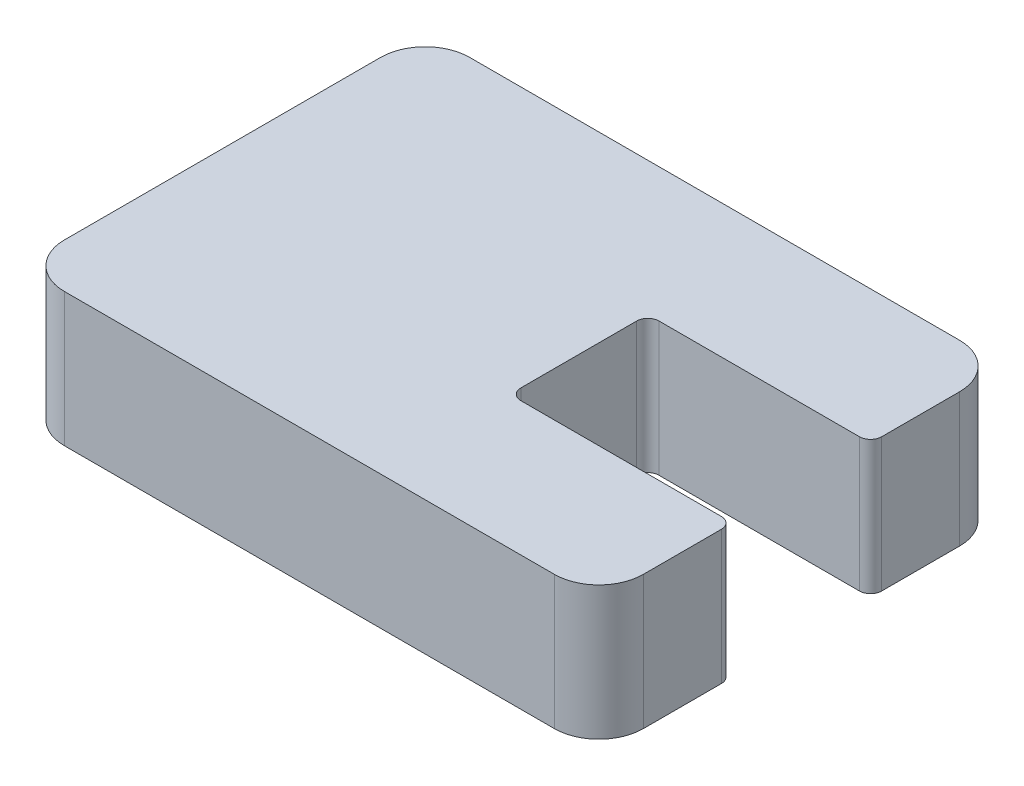
ISO-10303-21;
HEADER;
FILE_DESCRIPTION(('STEP AP214'),'2;1');
FILE_NAME('part.step','',(''),(''),'','','');
FILE_SCHEMA(('AUTOMOTIVE_DESIGN { 1 0 10303 214 1 1 1 1 }'));
ENDSEC;
DATA;
#1=APPLICATION_CONTEXT('core data for automotive mechanical design processes');
#2=APPLICATION_PROTOCOL_DEFINITION('international standard','automotive_design',2000,#1);
#3=PRODUCT_CONTEXT('',#1,'mechanical');
#4=PRODUCT('Part','Part','',(#3));
#5=PRODUCT_RELATED_PRODUCT_CATEGORY('part','',(#4));
#6=PRODUCT_DEFINITION_FORMATION('','',#4);
#7=PRODUCT_DEFINITION_CONTEXT('part definition',#1,'design');
#8=PRODUCT_DEFINITION('design','',#6,#7);
#9=PRODUCT_DEFINITION_SHAPE('','',#8);
#10=(LENGTH_UNIT() NAMED_UNIT(*) SI_UNIT(.MILLI.,.METRE.));
#11=(NAMED_UNIT(*) PLANE_ANGLE_UNIT() SI_UNIT($,.RADIAN.));
#12=(NAMED_UNIT(*) SI_UNIT($,.STERADIAN.) SOLID_ANGLE_UNIT());
#13=UNCERTAINTY_MEASURE_WITH_UNIT(LENGTH_MEASURE(1.E-05),#10,'distance_accuracy_value','');
#14=(GEOMETRIC_REPRESENTATION_CONTEXT(3) GLOBAL_UNCERTAINTY_ASSIGNED_CONTEXT((#13)) GLOBAL_UNIT_ASSIGNED_CONTEXT((#10,
#11,#12)) REPRESENTATION_CONTEXT('',''));
#15=CARTESIAN_POINT('',(0.,0.,0.));
#16=DIRECTION('',(0.,0.,1.));
#17=DIRECTION('',(1.,0.,0.));
#18=AXIS2_PLACEMENT_3D('',#15,#16,#17);
#19=CARTESIAN_POINT('',(12.,3.,3.55));
#20=DIRECTION('',(0.,-1.,0.));
#21=DIRECTION('',(0.,0.,-1.));
#22=AXIS2_PLACEMENT_3D('',#19,#20,#21);
#23=CYLINDRICAL_SURFACE('',#22,1.);
#24=CARTESIAN_POINT('',(12.,0.,3.55));
#25=DIRECTION('',(0.,1.,0.));
#26=DIRECTION('',(0.,0.,1.));
#27=AXIS2_PLACEMENT_3D('',#24,#25,#26);
#28=CIRCLE('',#27,1.);
#29=CARTESIAN_POINT('',(12.,0.,4.55));
#30=VERTEX_POINT('',#29);
#31=CARTESIAN_POINT('',(13.,0.,3.55));
#32=VERTEX_POINT('',#31);
#33=EDGE_CURVE('E170',#30,#32,#28,.T.);
#34=ORIENTED_EDGE('',*,*,#33,.T.);
#35=DIRECTION('',(0.,-1.,0.));
#36=VECTOR('',#35,1.);
#37=CARTESIAN_POINT('',(13.,3.,3.55));
#38=LINE('',#37,#36);
#39=CARTESIAN_POINT('',(13.,3.,3.55));
#40=VERTEX_POINT('',#39);
#41=EDGE_CURVE('E152',#40,#32,#38,.T.);
#42=ORIENTED_EDGE('',*,*,#41,.F.);
#43=CARTESIAN_POINT('',(12.,3.,3.55));
#44=DIRECTION('',(0.,1.,0.));
#45=DIRECTION('',(0.,0.,1.));
#46=AXIS2_PLACEMENT_3D('',#43,#44,#45);
#47=CIRCLE('',#46,1.);
#48=CARTESIAN_POINT('',(12.,3.,4.55));
#49=VERTEX_POINT('',#48);
#50=EDGE_CURVE('E158',#49,#40,#47,.T.);
#51=ORIENTED_EDGE('',*,*,#50,.F.);
#52=DIRECTION('',(0.,-1.,0.));
#53=VECTOR('',#52,1.);
#54=CARTESIAN_POINT('',(12.,3.,4.55));
#55=LINE('',#54,#53);
#56=EDGE_CURVE('E245',#49,#30,#55,.T.);
#57=ORIENTED_EDGE('',*,*,#56,.T.);
#58=EDGE_LOOP('',(#34,#42,#51,#57));
#59=FACE_BOUND('',#58,.T.);
#60=ADVANCED_FACE('F33',(#59),#23,.T.);
#61=CARTESIAN_POINT('',(13.,3.,3.55));
#62=DIRECTION('',(-1.,0.,0.));
#63=DIRECTION('',(0.,0.,1.));
#64=AXIS2_PLACEMENT_3D('',#61,#62,#63);
#65=PLANE('',#64);
#66=DIRECTION('',(0.,0.,-1.));
#67=VECTOR('',#66,1.);
#68=CARTESIAN_POINT('',(13.,0.,3.55));
#69=LINE('',#68,#67);
#70=CARTESIAN_POINT('',(13.,0.,1.8));
#71=VERTEX_POINT('',#70);
#72=EDGE_CURVE('E247',#32,#71,#69,.T.);
#73=ORIENTED_EDGE('',*,*,#72,.T.);
#74=DIRECTION('',(0.,-1.,0.));
#75=VECTOR('',#74,1.);
#76=CARTESIAN_POINT('',(13.,3.,1.8));
#77=LINE('',#76,#75);
#78=CARTESIAN_POINT('',(13.,3.,1.8));
#79=VERTEX_POINT('',#78);
#80=EDGE_CURVE('E155',#71,#79,#77,.F.);
#81=ORIENTED_EDGE('',*,*,#80,.T.);
#82=DIRECTION('',(0.,0.,-1.));
#83=VECTOR('',#82,1.);
#84=CARTESIAN_POINT('',(13.,3.,3.55));
#85=LINE('',#84,#83);
#86=EDGE_CURVE('E147',#40,#79,#85,.T.);
#87=ORIENTED_EDGE('',*,*,#86,.F.);
#88=ORIENTED_EDGE('',*,*,#41,.T.);
#89=EDGE_LOOP('',(#73,#81,#87,#88));
#90=FACE_BOUND('',#89,.T.);
#91=ADVANCED_FACE('F150',(#90),#65,.F.);
#92=CARTESIAN_POINT('',(13.,3.,1.55));
#93=DIRECTION('',(0.,0.,1.));
#94=DIRECTION('',(1.,0.,0.));
#95=AXIS2_PLACEMENT_3D('',#92,#93,#94);
#96=PLANE('',#95);
#97=DIRECTION('',(-1.,0.,0.));
#98=VECTOR('',#97,1.);
#99=CARTESIAN_POINT('',(13.,3.,1.55));
#100=LINE('',#99,#98);
#101=CARTESIAN_POINT('',(12.75,3.,1.55));
#102=VERTEX_POINT('',#101);
#103=CARTESIAN_POINT('',(8.25,3.,1.55));
#104=VERTEX_POINT('',#103);
#105=EDGE_CURVE('E157',#102,#104,#100,.T.);
#106=ORIENTED_EDGE('',*,*,#105,.F.);
#107=DIRECTION('',(0.,-1.,0.));
#108=VECTOR('',#107,1.);
#109=CARTESIAN_POINT('',(12.75,3.,1.55));
#110=LINE('',#109,#108);
#111=CARTESIAN_POINT('',(12.75,0.,1.55));
#112=VERTEX_POINT('',#111);
#113=EDGE_CURVE('E174',#102,#112,#110,.T.);
#114=ORIENTED_EDGE('',*,*,#113,.T.);
#115=DIRECTION('',(-1.,0.,0.));
#116=VECTOR('',#115,1.);
#117=CARTESIAN_POINT('',(13.,0.,1.55));
#118=LINE('',#117,#116);
#119=CARTESIAN_POINT('',(8.25,0.,1.55));
#120=VERTEX_POINT('',#119);
#121=EDGE_CURVE('E222',#112,#120,#118,.T.);
#122=ORIENTED_EDGE('',*,*,#121,.T.);
#123=DIRECTION('',(0.,-1.,0.));
#124=VECTOR('',#123,1.);
#125=CARTESIAN_POINT('',(8.25,3.,1.55));
#126=LINE('',#125,#124);
#127=EDGE_CURVE('E171',#120,#104,#126,.F.);
#128=ORIENTED_EDGE('',*,*,#127,.T.);
#129=EDGE_LOOP('',(#106,#114,#122,#128));
#130=FACE_BOUND('',#129,.T.);
#131=ADVANCED_FACE('F325',(#130),#96,.F.);
#132=CARTESIAN_POINT('',(8.,3.,1.55));
#133=DIRECTION('',(-1.,0.,0.));
#134=DIRECTION('',(0.,0.,1.));
#135=AXIS2_PLACEMENT_3D('',#132,#133,#134);
#136=PLANE('',#135);
#137=DIRECTION('',(0.,0.,-1.));
#138=VECTOR('',#137,1.);
#139=CARTESIAN_POINT('',(8.,3.,1.55));
#140=LINE('',#139,#138);
#141=CARTESIAN_POINT('',(8.,3.,1.3));
#142=VERTEX_POINT('',#141);
#143=CARTESIAN_POINT('',(8.,3.,-1.3));
#144=VERTEX_POINT('',#143);
#145=EDGE_CURVE('E226',#142,#144,#140,.T.);
#146=ORIENTED_EDGE('',*,*,#145,.F.);
#147=DIRECTION('',(0.,-1.,0.));
#148=VECTOR('',#147,1.);
#149=CARTESIAN_POINT('',(8.,0.,1.3));
#150=LINE('',#149,#148);
#151=CARTESIAN_POINT('',(8.,0.,1.3));
#152=VERTEX_POINT('',#151);
#153=EDGE_CURVE('E200',#142,#152,#150,.T.);
#154=ORIENTED_EDGE('',*,*,#153,.T.);
#155=DIRECTION('',(0.,0.,-1.));
#156=VECTOR('',#155,1.);
#157=CARTESIAN_POINT('',(8.,0.,1.55));
#158=LINE('',#157,#156);
#159=CARTESIAN_POINT('',(8.,0.,-1.3));
#160=VERTEX_POINT('',#159);
#161=EDGE_CURVE('E212',#152,#160,#158,.T.);
#162=ORIENTED_EDGE('',*,*,#161,.T.);
#163=DIRECTION('',(0.,-1.,0.));
#164=VECTOR('',#163,1.);
#165=CARTESIAN_POINT('',(8.,3.,-1.3));
#166=LINE('',#165,#164);
#167=EDGE_CURVE('E198',#160,#144,#166,.F.);
#168=ORIENTED_EDGE('',*,*,#167,.T.);
#169=EDGE_LOOP('',(#146,#154,#162,#168));
#170=FACE_BOUND('',#169,.T.);
#171=ADVANCED_FACE('F219',(#170),#136,.F.);
#172=CARTESIAN_POINT('',(8.,3.,-1.55));
#173=DIRECTION('',(0.,0.,-1.));
#174=DIRECTION('',(-1.,0.,0.));
#175=AXIS2_PLACEMENT_3D('',#172,#173,#174);
#176=PLANE('',#175);
#177=DIRECTION('',(1.,0.,0.));
#178=VECTOR('',#177,1.);
#179=CARTESIAN_POINT('',(8.,0.,-1.55));
#180=LINE('',#179,#178);
#181=CARTESIAN_POINT('',(8.25,0.,-1.55));
#182=VERTEX_POINT('',#181);
#183=CARTESIAN_POINT('',(12.75,0.,-1.55));
#184=VERTEX_POINT('',#183);
#185=EDGE_CURVE('E213',#182,#184,#180,.T.);
#186=ORIENTED_EDGE('',*,*,#185,.T.);
#187=DIRECTION('',(0.,-1.,0.));
#188=VECTOR('',#187,1.);
#189=CARTESIAN_POINT('',(12.75,3.,-1.55));
#190=LINE('',#189,#188);
#191=CARTESIAN_POINT('',(12.75,3.,-1.55));
#192=VERTEX_POINT('',#191);
#193=EDGE_CURVE('E56',#184,#192,#190,.F.);
#194=ORIENTED_EDGE('',*,*,#193,.T.);
#195=DIRECTION('',(1.,0.,0.));
#196=VECTOR('',#195,1.);
#197=CARTESIAN_POINT('',(8.,3.,-1.55));
#198=LINE('',#197,#196);
#199=CARTESIAN_POINT('',(8.25,3.,-1.55));
#200=VERTEX_POINT('',#199);
#201=EDGE_CURVE('E225',#200,#192,#198,.T.);
#202=ORIENTED_EDGE('',*,*,#201,.F.);
#203=DIRECTION('',(0.,-1.,0.));
#204=VECTOR('',#203,1.);
#205=CARTESIAN_POINT('',(8.25,0.,-1.55));
#206=LINE('',#205,#204);
#207=EDGE_CURVE('E194',#200,#182,#206,.T.);
#208=ORIENTED_EDGE('',*,*,#207,.T.);
#209=EDGE_LOOP('',(#186,#194,#202,#208));
#210=FACE_BOUND('',#209,.T.);
#211=ADVANCED_FACE('F227',(#210),#176,.F.);
#212=CARTESIAN_POINT('',(13.,3.,-1.55));
#213=DIRECTION('',(-1.,0.,0.));
#214=DIRECTION('',(0.,0.,1.));
#215=AXIS2_PLACEMENT_3D('',#212,#213,#214);
#216=PLANE('',#215);
#217=DIRECTION('',(0.,0.,-1.));
#218=VECTOR('',#217,1.);
#219=CARTESIAN_POINT('',(13.,3.,-1.55));
#220=LINE('',#219,#218);
#221=CARTESIAN_POINT('',(13.,3.,-1.8));
#222=VERTEX_POINT('',#221);
#223=CARTESIAN_POINT('',(13.,3.,-3.55));
#224=VERTEX_POINT('',#223);
#225=EDGE_CURVE('E228',#222,#224,#220,.T.);
#226=ORIENTED_EDGE('',*,*,#225,.F.);
#227=DIRECTION('',(0.,-1.,0.));
#228=VECTOR('',#227,1.);
#229=CARTESIAN_POINT('',(13.,3.,-1.8));
#230=LINE('',#229,#228);
#231=CARTESIAN_POINT('',(13.,0.,-1.8));
#232=VERTEX_POINT('',#231);
#233=EDGE_CURVE('E191',#222,#232,#230,.T.);
#234=ORIENTED_EDGE('',*,*,#233,.T.);
#235=DIRECTION('',(0.,0.,-1.));
#236=VECTOR('',#235,1.);
#237=CARTESIAN_POINT('',(13.,0.,-1.55));
#238=LINE('',#237,#236);
#239=CARTESIAN_POINT('',(13.,0.,-3.55));
#240=VERTEX_POINT('',#239);
#241=EDGE_CURVE('E252',#232,#240,#238,.T.);
#242=ORIENTED_EDGE('',*,*,#241,.T.);
#243=DIRECTION('',(0.,-1.,0.));
#244=VECTOR('',#243,1.);
#245=CARTESIAN_POINT('',(13.,3.,-3.55));
#246=LINE('',#245,#244);
#247=EDGE_CURVE('E172',#224,#240,#246,.T.);
#248=ORIENTED_EDGE('',*,*,#247,.F.);
#249=EDGE_LOOP('',(#226,#234,#242,#248));
#250=FACE_BOUND('',#249,.T.);
#251=ADVANCED_FACE('F304',(#250),#216,.F.);
#252=CARTESIAN_POINT('',(12.,3.,-3.55));
#253=DIRECTION('',(0.,-1.,0.));
#254=DIRECTION('',(0.,0.,-1.));
#255=AXIS2_PLACEMENT_3D('',#252,#253,#254);
#256=CYLINDRICAL_SURFACE('',#255,1.);
#257=CARTESIAN_POINT('',(12.,0.,-3.55));
#258=DIRECTION('',(0.,1.,0.));
#259=DIRECTION('',(0.,0.,1.));
#260=AXIS2_PLACEMENT_3D('',#257,#258,#259);
#261=CIRCLE('',#260,1.);
#262=CARTESIAN_POINT('',(12.,0.,-4.55));
#263=VERTEX_POINT('',#262);
#264=EDGE_CURVE('E254',#240,#263,#261,.T.);
#265=ORIENTED_EDGE('',*,*,#264,.T.);
#266=DIRECTION('',(0.,-1.,0.));
#267=VECTOR('',#266,1.);
#268=CARTESIAN_POINT('',(12.,3.,-4.55));
#269=LINE('',#268,#267);
#270=CARTESIAN_POINT('',(12.,3.,-4.55));
#271=VERTEX_POINT('',#270);
#272=EDGE_CURVE('E177',#271,#263,#269,.T.);
#273=ORIENTED_EDGE('',*,*,#272,.F.);
#274=CARTESIAN_POINT('',(12.,3.,-3.55));
#275=DIRECTION('',(0.,1.,0.));
#276=DIRECTION('',(0.,0.,1.));
#277=AXIS2_PLACEMENT_3D('',#274,#275,#276);
#278=CIRCLE('',#277,1.);
#279=EDGE_CURVE('E230',#224,#271,#278,.T.);
#280=ORIENTED_EDGE('',*,*,#279,.F.);
#281=ORIENTED_EDGE('',*,*,#247,.T.);
#282=EDGE_LOOP('',(#265,#273,#280,#281));
#283=FACE_BOUND('',#282,.T.);
#284=ADVANCED_FACE('F302',(#283),#256,.T.);
#285=CARTESIAN_POINT('',(12.,3.,-4.55));
#286=DIRECTION('',(0.,0.,1.));
#287=DIRECTION('',(1.,0.,0.));
#288=AXIS2_PLACEMENT_3D('',#285,#286,#287);
#289=PLANE('',#288);
#290=DIRECTION('',(-1.,0.,0.));
#291=VECTOR('',#290,1.);
#292=CARTESIAN_POINT('',(12.,0.,-4.55));
#293=LINE('',#292,#291);
#294=CARTESIAN_POINT('',(1.,0.,-4.55));
#295=VERTEX_POINT('',#294);
#296=EDGE_CURVE('E256',#263,#295,#293,.T.);
#297=ORIENTED_EDGE('',*,*,#296,.T.);
#298=DIRECTION('',(0.,-1.,0.));
#299=VECTOR('',#298,1.);
#300=CARTESIAN_POINT('',(1.,3.,-4.55));
#301=LINE('',#300,#299);
#302=CARTESIAN_POINT('',(1.,3.,-4.55));
#303=VERTEX_POINT('',#302);
#304=EDGE_CURVE('E275',#303,#295,#301,.T.);
#305=ORIENTED_EDGE('',*,*,#304,.F.);
#306=DIRECTION('',(-1.,0.,0.));
#307=VECTOR('',#306,1.);
#308=CARTESIAN_POINT('',(12.,3.,-4.55));
#309=LINE('',#308,#307);
#310=EDGE_CURVE('E236',#271,#303,#309,.T.);
#311=ORIENTED_EDGE('',*,*,#310,.F.);
#312=ORIENTED_EDGE('',*,*,#272,.T.);
#313=EDGE_LOOP('',(#297,#305,#311,#312));
#314=FACE_BOUND('',#313,.T.);
#315=ADVANCED_FACE('F282',(#314),#289,.F.);
#316=CARTESIAN_POINT('',(1.,3.,-3.55));
#317=DIRECTION('',(0.,-1.,0.));
#318=DIRECTION('',(0.,0.,-1.));
#319=AXIS2_PLACEMENT_3D('',#316,#317,#318);
#320=CYLINDRICAL_SURFACE('',#319,1.);
#321=CARTESIAN_POINT('',(1.,0.,-3.55));
#322=DIRECTION('',(0.,1.,0.));
#323=DIRECTION('',(0.,0.,-1.));
#324=AXIS2_PLACEMENT_3D('',#321,#322,#323);
#325=CIRCLE('',#324,1.);
#326=CARTESIAN_POINT('',(0.,0.,-3.54999999999999));
#327=VERTEX_POINT('',#326);
#328=EDGE_CURVE('E258',#295,#327,#325,.T.);
#329=ORIENTED_EDGE('',*,*,#328,.T.);
#330=DIRECTION('',(0.,-1.,0.));
#331=VECTOR('',#330,1.);
#332=CARTESIAN_POINT('',(0.,3.,-3.54999999999999));
#333=LINE('',#332,#331);
#334=CARTESIAN_POINT('',(0.,3.,-3.54999999999999));
#335=VERTEX_POINT('',#334);
#336=EDGE_CURVE('E272',#335,#327,#333,.T.);
#337=ORIENTED_EDGE('',*,*,#336,.F.);
#338=CARTESIAN_POINT('',(1.,3.,-3.55));
#339=DIRECTION('',(0.,1.,0.));
#340=DIRECTION('',(0.,0.,-1.));
#341=AXIS2_PLACEMENT_3D('',#338,#339,#340);
#342=CIRCLE('',#341,1.);
#343=EDGE_CURVE('E238',#303,#335,#342,.T.);
#344=ORIENTED_EDGE('',*,*,#343,.F.);
#345=ORIENTED_EDGE('',*,*,#304,.T.);
#346=EDGE_LOOP('',(#329,#337,#344,#345));
#347=FACE_BOUND('',#346,.T.);
#348=ADVANCED_FACE('F293',(#347),#320,.T.);
#349=CARTESIAN_POINT('',(0.,3.,-3.54999999999999));
#350=DIRECTION('',(1.,0.,0.));
#351=DIRECTION('',(0.,0.,-1.));
#352=AXIS2_PLACEMENT_3D('',#349,#350,#351);
#353=PLANE('',#352);
#354=DIRECTION('',(0.,0.,1.));
#355=VECTOR('',#354,1.);
#356=CARTESIAN_POINT('',(0.,0.,-3.54999999999999));
#357=LINE('',#356,#355);
#358=CARTESIAN_POINT('',(0.,0.,3.54999999999999));
#359=VERTEX_POINT('',#358);
#360=EDGE_CURVE('E260',#327,#359,#357,.T.);
#361=ORIENTED_EDGE('',*,*,#360,.T.);
#362=DIRECTION('',(0.,-1.,0.));
#363=VECTOR('',#362,1.);
#364=CARTESIAN_POINT('',(0.,3.,3.54999999999999));
#365=LINE('',#364,#363);
#366=CARTESIAN_POINT('',(0.,3.,3.54999999999999));
#367=VERTEX_POINT('',#366);
#368=EDGE_CURVE('E269',#367,#359,#365,.T.);
#369=ORIENTED_EDGE('',*,*,#368,.F.);
#370=DIRECTION('',(0.,0.,1.));
#371=VECTOR('',#370,1.);
#372=CARTESIAN_POINT('',(0.,3.,-3.54999999999999));
#373=LINE('',#372,#371);
#374=EDGE_CURVE('E240',#335,#367,#373,.T.);
#375=ORIENTED_EDGE('',*,*,#374,.F.);
#376=ORIENTED_EDGE('',*,*,#336,.T.);
#377=EDGE_LOOP('',(#361,#369,#375,#376));
#378=FACE_BOUND('',#377,.T.);
#379=ADVANCED_FACE('F297',(#378),#353,.F.);
#380=CARTESIAN_POINT('',(1.,3.,3.55));
#381=DIRECTION('',(0.,-1.,0.));
#382=DIRECTION('',(0.,0.,-1.));
#383=AXIS2_PLACEMENT_3D('',#380,#381,#382);
#384=CYLINDRICAL_SURFACE('',#383,1.);
#385=CARTESIAN_POINT('',(1.,0.,3.55));
#386=DIRECTION('',(0.,1.,0.));
#387=DIRECTION('',(0.,0.,1.));
#388=AXIS2_PLACEMENT_3D('',#385,#386,#387);
#389=CIRCLE('',#388,1.);
#390=CARTESIAN_POINT('',(1.00000000000001,0.,4.55));
#391=VERTEX_POINT('',#390);
#392=EDGE_CURVE('E262',#359,#391,#389,.T.);
#393=ORIENTED_EDGE('',*,*,#392,.T.);
#394=DIRECTION('',(0.,-1.,0.));
#395=VECTOR('',#394,1.);
#396=CARTESIAN_POINT('',(1.00000000000001,3.,4.55));
#397=LINE('',#396,#395);
#398=CARTESIAN_POINT('',(1.00000000000001,3.,4.55));
#399=VERTEX_POINT('',#398);
#400=EDGE_CURVE('E266',#399,#391,#397,.T.);
#401=ORIENTED_EDGE('',*,*,#400,.F.);
#402=CARTESIAN_POINT('',(1.,3.,3.55));
#403=DIRECTION('',(0.,1.,0.));
#404=DIRECTION('',(0.,0.,1.));
#405=AXIS2_PLACEMENT_3D('',#402,#403,#404);
#406=CIRCLE('',#405,1.);
#407=EDGE_CURVE('E242',#367,#399,#406,.T.);
#408=ORIENTED_EDGE('',*,*,#407,.F.);
#409=ORIENTED_EDGE('',*,*,#368,.T.);
#410=EDGE_LOOP('',(#393,#401,#408,#409));
#411=FACE_BOUND('',#410,.T.);
#412=ADVANCED_FACE('F345',(#411),#384,.T.);
#413=CARTESIAN_POINT('',(1.00000000000001,3.,4.55));
#414=DIRECTION('',(0.,0.,-1.));
#415=DIRECTION('',(-1.,0.,0.));
#416=AXIS2_PLACEMENT_3D('',#413,#414,#415);
#417=PLANE('',#416);
#418=DIRECTION('',(1.,0.,0.));
#419=VECTOR('',#418,1.);
#420=CARTESIAN_POINT('',(1.00000000000001,0.,4.55));
#421=LINE('',#420,#419);
#422=EDGE_CURVE('E167',#391,#30,#421,.T.);
#423=ORIENTED_EDGE('',*,*,#422,.T.);
#424=ORIENTED_EDGE('',*,*,#56,.F.);
#425=DIRECTION('',(1.,0.,0.));
#426=VECTOR('',#425,1.);
#427=CARTESIAN_POINT('',(1.00000000000001,3.,4.55));
#428=LINE('',#427,#426);
#429=EDGE_CURVE('E163',#399,#49,#428,.T.);
#430=ORIENTED_EDGE('',*,*,#429,.F.);
#431=ORIENTED_EDGE('',*,*,#400,.T.);
#432=EDGE_LOOP('',(#423,#424,#430,#431));
#433=FACE_BOUND('',#432,.T.);
#434=ADVANCED_FACE('F348',(#433),#417,.F.);
#435=CARTESIAN_POINT('',(12.,3.,3.55));
#436=DIRECTION('',(0.,1.,0.));
#437=DIRECTION('',(0.,0.,1.));
#438=AXIS2_PLACEMENT_3D('',#435,#436,#437);
#439=PLANE('',#438);
#440=ORIENTED_EDGE('',*,*,#86,.T.);
#441=CARTESIAN_POINT('',(12.75,3.,1.8));
#442=DIRECTION('',(0.,1.,0.));
#443=DIRECTION('',(0.,0.,1.));
#444=AXIS2_PLACEMENT_3D('',#441,#442,#443);
#445=CIRCLE('',#444,0.25);
#446=EDGE_CURVE('E189',#79,#102,#445,.T.);
#447=ORIENTED_EDGE('',*,*,#446,.T.);
#448=ORIENTED_EDGE('',*,*,#105,.T.);
#449=CARTESIAN_POINT('',(8.25,3.,1.3));
#450=DIRECTION('',(0.,1.,0.));
#451=DIRECTION('',(0.,0.,1.));
#452=AXIS2_PLACEMENT_3D('',#449,#450,#451);
#453=CIRCLE('',#452,0.25);
#454=EDGE_CURVE('E205',#104,#142,#453,.F.);
#455=ORIENTED_EDGE('',*,*,#454,.T.);
#456=ORIENTED_EDGE('',*,*,#145,.T.);
#457=CARTESIAN_POINT('',(8.25,3.,-1.3));
#458=DIRECTION('',(0.,1.,0.));
#459=DIRECTION('',(0.,0.,1.));
#460=AXIS2_PLACEMENT_3D('',#457,#458,#459);
#461=CIRCLE('',#460,0.25);
#462=EDGE_CURVE('E11',#144,#200,#461,.F.);
#463=ORIENTED_EDGE('',*,*,#462,.T.);
#464=ORIENTED_EDGE('',*,*,#201,.T.);
#465=CARTESIAN_POINT('',(12.75,3.,-1.8));
#466=DIRECTION('',(0.,1.,0.));
#467=DIRECTION('',(0.,0.,1.));
#468=AXIS2_PLACEMENT_3D('',#465,#466,#467);
#469=CIRCLE('',#468,0.25);
#470=EDGE_CURVE('E48',#192,#222,#469,.T.);
#471=ORIENTED_EDGE('',*,*,#470,.T.);
#472=ORIENTED_EDGE('',*,*,#225,.T.);
#473=ORIENTED_EDGE('',*,*,#279,.T.);
#474=ORIENTED_EDGE('',*,*,#310,.T.);
#475=ORIENTED_EDGE('',*,*,#343,.T.);
#476=ORIENTED_EDGE('',*,*,#374,.T.);
#477=ORIENTED_EDGE('',*,*,#407,.T.);
#478=ORIENTED_EDGE('',*,*,#429,.T.);
#479=ORIENTED_EDGE('',*,*,#50,.T.);
#480=EDGE_LOOP('',(#440,#447,#448,#455,#456,#463,#464,#471,#472,#473,#474,#475,#476,#477,#478,#479));
#481=FACE_BOUND('',#480,.T.);
#482=ADVANCED_FACE('F161',(#481),#439,.T.);
#483=CARTESIAN_POINT('',(12.,0.,3.55));
#484=DIRECTION('',(0.,1.,0.));
#485=DIRECTION('',(0.,0.,1.));
#486=AXIS2_PLACEMENT_3D('',#483,#484,#485);
#487=PLANE('',#486);
#488=ORIENTED_EDGE('',*,*,#121,.F.);
#489=CARTESIAN_POINT('',(12.75,0.,1.8));
#490=DIRECTION('',(0.,1.,0.));
#491=DIRECTION('',(0.,0.,1.));
#492=AXIS2_PLACEMENT_3D('',#489,#490,#491);
#493=CIRCLE('',#492,0.25);
#494=EDGE_CURVE('E185',#112,#71,#493,.F.);
#495=ORIENTED_EDGE('',*,*,#494,.T.);
#496=ORIENTED_EDGE('',*,*,#72,.F.);
#497=ORIENTED_EDGE('',*,*,#33,.F.);
#498=ORIENTED_EDGE('',*,*,#422,.F.);
#499=ORIENTED_EDGE('',*,*,#392,.F.);
#500=ORIENTED_EDGE('',*,*,#360,.F.);
#501=ORIENTED_EDGE('',*,*,#328,.F.);
#502=ORIENTED_EDGE('',*,*,#296,.F.);
#503=ORIENTED_EDGE('',*,*,#264,.F.);
#504=ORIENTED_EDGE('',*,*,#241,.F.);
#505=CARTESIAN_POINT('',(12.75,0.,-1.8));
#506=DIRECTION('',(0.,1.,0.));
#507=DIRECTION('',(0.,0.,1.));
#508=AXIS2_PLACEMENT_3D('',#505,#506,#507);
#509=CIRCLE('',#508,0.25);
#510=EDGE_CURVE('E183',#232,#184,#509,.F.);
#511=ORIENTED_EDGE('',*,*,#510,.T.);
#512=ORIENTED_EDGE('',*,*,#185,.F.);
#513=CARTESIAN_POINT('',(8.25,0.,-1.3));
#514=DIRECTION('',(0.,1.,0.));
#515=DIRECTION('',(0.,0.,1.));
#516=AXIS2_PLACEMENT_3D('',#513,#514,#515);
#517=CIRCLE('',#516,0.25);
#518=EDGE_CURVE('E41',#182,#160,#517,.T.);
#519=ORIENTED_EDGE('',*,*,#518,.T.);
#520=ORIENTED_EDGE('',*,*,#161,.F.);
#521=CARTESIAN_POINT('',(8.25,0.,1.3));
#522=DIRECTION('',(0.,1.,0.));
#523=DIRECTION('',(0.,0.,1.));
#524=AXIS2_PLACEMENT_3D('',#521,#522,#523);
#525=CIRCLE('',#524,0.25);
#526=EDGE_CURVE('E203',#152,#120,#525,.T.);
#527=ORIENTED_EDGE('',*,*,#526,.T.);
#528=EDGE_LOOP('',(#488,#495,#496,#497,#498,#499,#500,#501,#502,#503,#504,#511,#512,#519,#520,#527));
#529=FACE_BOUND('',#528,.T.);
#530=ADVANCED_FACE('F211',(#529),#487,.F.);
#531=CARTESIAN_POINT('',(12.75,3.,1.8));
#532=DIRECTION('',(0.,-1.,0.));
#533=DIRECTION('',(0.,0.,-1.));
#534=AXIS2_PLACEMENT_3D('',#531,#532,#533);
#535=CYLINDRICAL_SURFACE('',#534,0.25);
#536=ORIENTED_EDGE('',*,*,#446,.F.);
#537=ORIENTED_EDGE('',*,*,#80,.F.);
#538=ORIENTED_EDGE('',*,*,#494,.F.);
#539=ORIENTED_EDGE('',*,*,#113,.F.);
#540=EDGE_LOOP('',(#536,#537,#538,#539));
#541=FACE_BOUND('',#540,.T.);
#542=ADVANCED_FACE('F310',(#541),#535,.T.);
#543=CARTESIAN_POINT('',(12.75,3.,-1.8));
#544=DIRECTION('',(0.,-1.,0.));
#545=DIRECTION('',(0.,0.,-1.));
#546=AXIS2_PLACEMENT_3D('',#543,#544,#545);
#547=CYLINDRICAL_SURFACE('',#546,0.25);
#548=ORIENTED_EDGE('',*,*,#470,.F.);
#549=ORIENTED_EDGE('',*,*,#193,.F.);
#550=ORIENTED_EDGE('',*,*,#510,.F.);
#551=ORIENTED_EDGE('',*,*,#233,.F.);
#552=EDGE_LOOP('',(#548,#549,#550,#551));
#553=FACE_BOUND('',#552,.T.);
#554=ADVANCED_FACE('F307',(#553),#547,.T.);
#555=CARTESIAN_POINT('',(8.25,3.,1.3));
#556=DIRECTION('',(0.,1.,0.));
#557=DIRECTION('',(0.,0.,1.));
#558=AXIS2_PLACEMENT_3D('',#555,#556,#557);
#559=CYLINDRICAL_SURFACE('',#558,0.25);
#560=ORIENTED_EDGE('',*,*,#454,.F.);
#561=ORIENTED_EDGE('',*,*,#127,.F.);
#562=ORIENTED_EDGE('',*,*,#526,.F.);
#563=ORIENTED_EDGE('',*,*,#153,.F.);
#564=EDGE_LOOP('',(#560,#561,#562,#563));
#565=FACE_BOUND('',#564,.T.);
#566=ADVANCED_FACE('F309',(#565),#559,.F.);
#567=CARTESIAN_POINT('',(8.25,3.,-1.3));
#568=DIRECTION('',(0.,1.,0.));
#569=DIRECTION('',(0.,0.,1.));
#570=AXIS2_PLACEMENT_3D('',#567,#568,#569);
#571=CYLINDRICAL_SURFACE('',#570,0.25);
#572=ORIENTED_EDGE('',*,*,#462,.F.);
#573=ORIENTED_EDGE('',*,*,#167,.F.);
#574=ORIENTED_EDGE('',*,*,#518,.F.);
#575=ORIENTED_EDGE('',*,*,#207,.F.);
#576=EDGE_LOOP('',(#572,#573,#574,#575));
#577=FACE_BOUND('',#576,.T.);
#578=ADVANCED_FACE('F35',(#577),#571,.F.);
#579=CLOSED_SHELL('',(#60,#91,#131,#171,#211,#251,#284,#315,#348,#379,#412,#434,#482,#530,#542,
#554,#566,#578));
#580=MANIFOLD_SOLID_BREP('B2',#579);
#581=ADVANCED_BREP_SHAPE_REPRESENTATION('',(#18,#580),#14);
#582=SHAPE_DEFINITION_REPRESENTATION(#9,#581);
ENDSEC;
END-ISO-10303-21;
